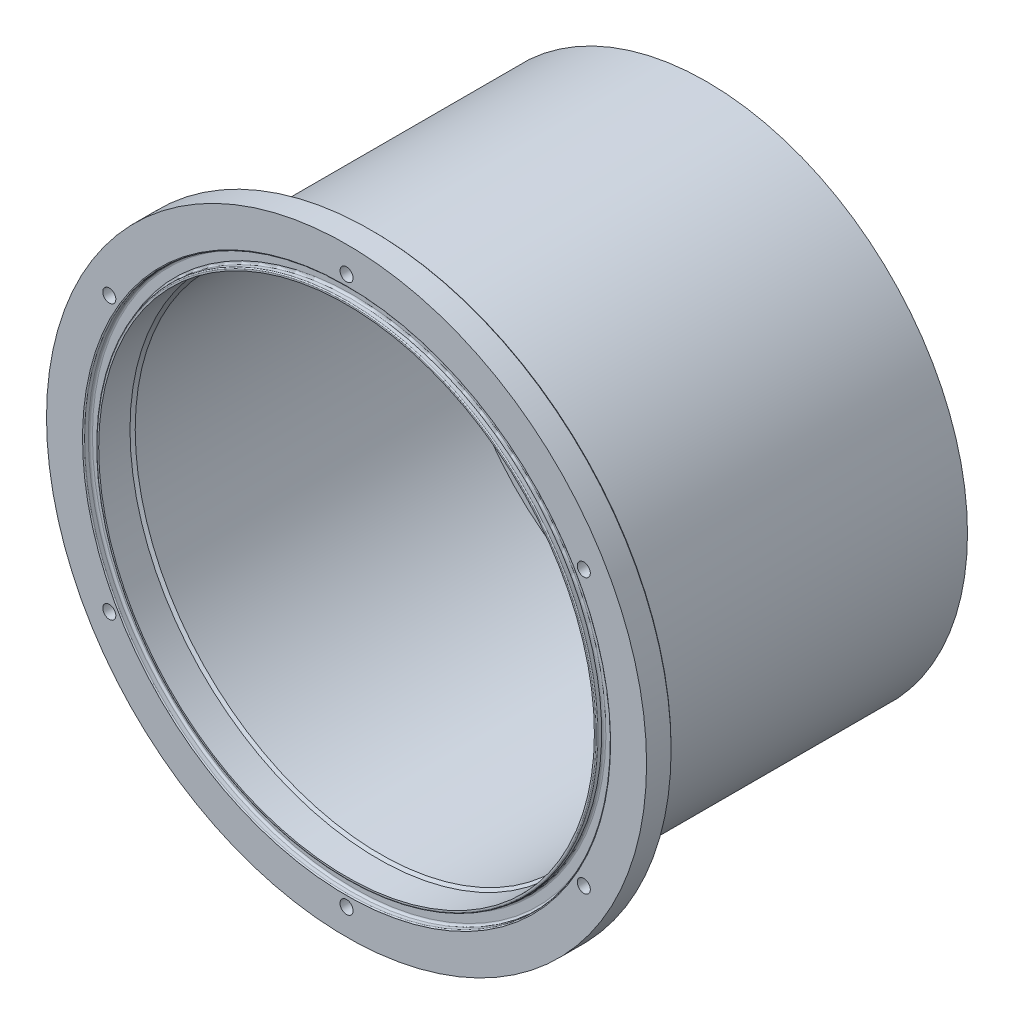
ISO-10303-21;
HEADER;
FILE_DESCRIPTION(('STEP AP214'),'2;1');
FILE_NAME('part.step','',(''),(''),'','','');
FILE_SCHEMA(('AUTOMOTIVE_DESIGN { 1 0 10303 214 1 1 1 1 }'));
ENDSEC;
DATA;
#1=APPLICATION_CONTEXT('core data for automotive mechanical design processes');
#2=APPLICATION_PROTOCOL_DEFINITION('international standard','automotive_design',2000,#1);
#3=PRODUCT_CONTEXT('',#1,'mechanical');
#4=PRODUCT('Part','Part','',(#3));
#5=PRODUCT_RELATED_PRODUCT_CATEGORY('part','',(#4));
#6=PRODUCT_DEFINITION_FORMATION('','',#4);
#7=PRODUCT_DEFINITION_CONTEXT('part definition',#1,'design');
#8=PRODUCT_DEFINITION('design','',#6,#7);
#9=PRODUCT_DEFINITION_SHAPE('','',#8);
#10=(LENGTH_UNIT() NAMED_UNIT(*) SI_UNIT(.MILLI.,.METRE.));
#11=(NAMED_UNIT(*) PLANE_ANGLE_UNIT() SI_UNIT($,.RADIAN.));
#12=(NAMED_UNIT(*) SI_UNIT($,.STERADIAN.) SOLID_ANGLE_UNIT());
#13=UNCERTAINTY_MEASURE_WITH_UNIT(LENGTH_MEASURE(1.E-05),#10,'distance_accuracy_value','');
#14=(GEOMETRIC_REPRESENTATION_CONTEXT(3) GLOBAL_UNCERTAINTY_ASSIGNED_CONTEXT((#13)) GLOBAL_UNIT_ASSIGNED_CONTEXT((#10,
#11,#12)) REPRESENTATION_CONTEXT('',''));
#15=CARTESIAN_POINT('',(0.,0.,0.));
#16=DIRECTION('',(0.,0.,1.));
#17=DIRECTION('',(1.,0.,0.));
#18=AXIS2_PLACEMENT_3D('',#15,#16,#17);
#19=CARTESIAN_POINT('',(0.,0.00386803779899025,14.0038680378037));
#20=DIRECTION('',(0.,0.,-1.));
#21=DIRECTION('',(1.,0.,0.));
#22=AXIS2_PLACEMENT_3D('',#19,#20,#21);
#23=CYLINDRICAL_SURFACE('',#22,47.);
#24=CARTESIAN_POINT('',(0.,0.00386803779899025,-6.4961319621963));
#25=DIRECTION('',(0.,0.,1.));
#26=DIRECTION('',(-1.,0.,0.));
#27=AXIS2_PLACEMENT_3D('',#24,#25,#26);
#28=CIRCLE('',#27,47.);
#29=CARTESIAN_POINT('',(-47.,0.00386803779899025,-6.4961319621963));
#30=VERTEX_POINT('',#29);
#31=EDGE_CURVE('E136',#30,#30,#28,.F.);
#32=ORIENTED_EDGE('',*,*,#31,.F.);
#33=EDGE_LOOP('',(#32));
#34=FACE_BOUND('',#33,.T.);
#35=CARTESIAN_POINT('',(0.,0.00386803779901598,-65.9961319621962));
#36=DIRECTION('',(0.,0.,-1.));
#37=DIRECTION('',(-1.,0.,0.));
#38=AXIS2_PLACEMENT_3D('',#35,#36,#37);
#39=CIRCLE('',#38,47.);
#40=CARTESIAN_POINT('',(-47.,0.00386803779901598,-65.9961319621962));
#41=VERTEX_POINT('',#40);
#42=EDGE_CURVE('E142',#41,#41,#39,.T.);
#43=ORIENTED_EDGE('',*,*,#42,.T.);
#44=EDGE_LOOP('',(#43));
#45=FACE_BOUND('',#44,.T.);
#46=ADVANCED_FACE('F50',(#34,#45),#23,.F.);
#47=CARTESIAN_POINT('',(-48.4000000002915,0.00386803779948985,-1.29613196219625));
#48=DIRECTION('',(0.,0.,1.));
#49=DIRECTION('',(0.,1.,0.));
#50=AXIS2_PLACEMENT_3D('',#47,#48,#49);
#51=PLANE('',#50);
#52=CARTESIAN_POINT('',(0.,0.00386803779948985,-1.29613196219615));
#53=DIRECTION('',(0.,0.,-1.));
#54=DIRECTION('',(0.,1.,0.));
#55=AXIS2_PLACEMENT_3D('',#52,#53,#54);
#56=CIRCLE('',#55,50.0000000000247);
#57=CARTESIAN_POINT('',(0.,50.0038680378242,-1.29613196219613));
#58=VERTEX_POINT('',#57);
#59=EDGE_CURVE('E121',#58,#58,#56,.T.);
#60=ORIENTED_EDGE('',*,*,#59,.F.);
#61=EDGE_LOOP('',(#60));
#62=FACE_BOUND('',#61,.T.);
#63=CARTESIAN_POINT('',(0.,0.00386803779948985,-1.2961319621964));
#64=DIRECTION('',(0.,0.,-1.));
#65=DIRECTION('',(0.,1.,0.));
#66=AXIS2_PLACEMENT_3D('',#63,#64,#65);
#67=CIRCLE('',#66,48.4000000002921);
#68=CARTESIAN_POINT('',(0.,48.4038680380916,-1.29613196219638));
#69=VERTEX_POINT('',#68);
#70=EDGE_CURVE('E118',#69,#69,#67,.T.);
#71=ORIENTED_EDGE('',*,*,#70,.T.);
#72=EDGE_LOOP('',(#71));
#73=FACE_BOUND('',#72,.T.);
#74=ADVANCED_FACE('F157',(#62,#73),#51,.T.);
#75=CARTESIAN_POINT('',(0.,0.00386803779948985,-0.896131962333339));
#76=DIRECTION('',(0.,0.,1.));
#77=DIRECTION('',(0.,1.,0.));
#78=AXIS2_PLACEMENT_3D('',#75,#76,#77);
#79=TOROIDAL_SURFACE('',#78,48.3999999998605,0.399999999863066);
#80=ORIENTED_EDGE('',*,*,#70,.F.);
#81=EDGE_LOOP('',(#80));
#82=FACE_BOUND('',#81,.T.);
#83=CARTESIAN_POINT('',(0.,0.00386803779948985,-0.896131962333548));
#84=DIRECTION('',(0.,0.,-1.));
#85=DIRECTION('',(0.,1.,0.));
#86=AXIS2_PLACEMENT_3D('',#83,#84,#85);
#87=CIRCLE('',#86,47.9999999999974);
#88=CARTESIAN_POINT('',(0.,48.0038680377969,-0.896131962333529));
#89=VERTEX_POINT('',#88);
#90=EDGE_CURVE('E115',#89,#89,#87,.T.);
#91=ORIENTED_EDGE('',*,*,#90,.T.);
#92=EDGE_LOOP('',(#91));
#93=FACE_BOUND('',#92,.T.);
#94=ADVANCED_FACE('F166',(#82,#93),#79,.F.);
#95=CARTESIAN_POINT('',(0.,0.00386803779948985,0.00386803780375033));
#96=DIRECTION('',(0.,0.,1.));
#97=DIRECTION('',(0.,1.,0.));
#98=AXIS2_PLACEMENT_3D('',#95,#96,#97);
#99=CYLINDRICAL_SURFACE('',#98,47.9999999999987);
#100=ORIENTED_EDGE('',*,*,#90,.F.);
#101=EDGE_LOOP('',(#100));
#102=FACE_BOUND('',#101,.T.);
#103=CARTESIAN_POINT('',(0.,0.00386803779948985,-0.196131962257096));
#104=DIRECTION('',(0.,0.,-1.));
#105=DIRECTION('',(0.,1.,0.));
#106=AXIS2_PLACEMENT_3D('',#103,#104,#105);
#107=CIRCLE('',#106,48.);
#108=CARTESIAN_POINT('',(0.,48.0038680377995,-0.196131962257077));
#109=VERTEX_POINT('',#108);
#110=EDGE_CURVE('E109',#109,#109,#107,.T.);
#111=ORIENTED_EDGE('',*,*,#110,.T.);
#112=EDGE_LOOP('',(#111));
#113=FACE_BOUND('',#112,.T.);
#114=ADVANCED_FACE('F204',(#102,#113),#99,.T.);
#115=CARTESIAN_POINT('',(0.,0.00386803779948985,-0.196131962292546));
#116=DIRECTION('',(0.,0.,1.));
#117=DIRECTION('',(0.,1.,0.));
#118=AXIS2_PLACEMENT_3D('',#115,#116,#117);
#119=TOROIDAL_SURFACE('',#118,47.7999999999039,0.200000000096218);
#120=ORIENTED_EDGE('',*,*,#110,.F.);
#121=EDGE_LOOP('',(#120));
#122=FACE_BOUND('',#121,.T.);
#123=CARTESIAN_POINT('',(0.,0.00386803779948985,0.00386803780365319));
#124=DIRECTION('',(0.,0.,-1.));
#125=DIRECTION('',(0.,1.,0.));
#126=AXIS2_PLACEMENT_3D('',#123,#124,#125);
#127=CIRCLE('',#126,47.7999999998966);
#128=CARTESIAN_POINT('',(0.,47.8038680376961,0.00386803780367149));
#129=VERTEX_POINT('',#128);
#130=EDGE_CURVE('E112',#129,#129,#127,.T.);
#131=ORIENTED_EDGE('',*,*,#130,.T.);
#132=EDGE_LOOP('',(#131));
#133=FACE_BOUND('',#132,.T.);
#134=ADVANCED_FACE('F208',(#122,#133),#119,.T.);
#135=CARTESIAN_POINT('',(0.,0.00386803779924005,0.00386803780395156));
#136=DIRECTION('',(0.,0.,-1.));
#137=DIRECTION('',(-1.,0.,0.));
#138=AXIS2_PLACEMENT_3D('',#135,#136,#137);
#139=PLANE('',#138);
#140=CARTESIAN_POINT('',(0.,0.00386803779924005,0.00386803780370176));
#141=DIRECTION('',(0.,0.,-1.));
#142=DIRECTION('',(-1.,0.,0.));
#143=AXIS2_PLACEMENT_3D('',#140,#141,#142);
#144=CIRCLE('',#143,47.5);
#145=CARTESIAN_POINT('',(-47.5,0.00386803779924005,0.00386803780370176));
#146=VERTEX_POINT('',#145);
#147=EDGE_CURVE('E130',#146,#146,#144,.T.);
#148=ORIENTED_EDGE('',*,*,#147,.T.);
#149=EDGE_LOOP('',(#148));
#150=FACE_BOUND('',#149,.T.);
#151=ORIENTED_EDGE('',*,*,#130,.F.);
#152=EDGE_LOOP('',(#151));
#153=FACE_BOUND('',#152,.T.);
#154=ADVANCED_FACE('F212',(#150,#153),#139,.F.);
#155=CARTESIAN_POINT('',(0.,0.00386803779924005,-5.9961319621963));
#156=DIRECTION('',(0.,0.,1.));
#157=DIRECTION('',(1.,0.,0.));
#158=AXIS2_PLACEMENT_3D('',#155,#156,#157);
#159=CYLINDRICAL_SURFACE('',#158,47.5);
#160=CARTESIAN_POINT('',(0.,0.00386803779924005,-5.9961319621963));
#161=DIRECTION('',(0.,0.,-1.));
#162=DIRECTION('',(-1.,0.,0.));
#163=AXIS2_PLACEMENT_3D('',#160,#161,#162);
#164=CIRCLE('',#163,47.5);
#165=CARTESIAN_POINT('',(-47.5,0.00386803779924005,-5.9961319621963));
#166=VERTEX_POINT('',#165);
#167=EDGE_CURVE('E133',#166,#166,#164,.T.);
#168=ORIENTED_EDGE('',*,*,#167,.T.);
#169=EDGE_LOOP('',(#168));
#170=FACE_BOUND('',#169,.T.);
#171=ORIENTED_EDGE('',*,*,#147,.F.);
#172=EDGE_LOOP('',(#171));
#173=FACE_BOUND('',#172,.T.);
#174=ADVANCED_FACE('F182',(#170,#173),#159,.F.);
#175=CARTESIAN_POINT('',(0.,0.00386803779899025,-6.4961319621963));
#176=DIRECTION('',(0.,0.,1.));
#177=DIRECTION('',(1.,0.,0.));
#178=AXIS2_PLACEMENT_3D('',#175,#176,#177);
#179=CONICAL_SURFACE('',#178,47.,0.785398163397448);
#180=ORIENTED_EDGE('',*,*,#167,.F.);
#181=EDGE_LOOP('',(#180));
#182=FACE_BOUND('',#181,.T.);
#183=ORIENTED_EDGE('',*,*,#31,.T.);
#184=EDGE_LOOP('',(#183));
#185=FACE_BOUND('',#184,.T.);
#186=ADVANCED_FACE('F199',(#182,#185),#179,.F.);
#187=CARTESIAN_POINT('',(0.,0.00386803779948985,-0.896131962347099));
#188=DIRECTION('',(0.,0.,1.));
#189=DIRECTION('',(0.,1.,0.));
#190=AXIS2_PLACEMENT_3D('',#187,#188,#189);
#191=TOROIDAL_SURFACE('',#190,50.0000000001507,0.399999999849023);
#192=CARTESIAN_POINT('',(0.,0.00386803779948985,-0.8961319622642));
#193=DIRECTION('',(0.,0.,-1.));
#194=DIRECTION('',(0.,1.,0.));
#195=AXIS2_PLACEMENT_3D('',#192,#193,#194);
#196=CIRCLE('',#195,50.4);
#197=CARTESIAN_POINT('',(0.,50.4038680377995,-0.896131962264181));
#198=VERTEX_POINT('',#197);
#199=EDGE_CURVE('E124',#198,#198,#196,.T.);
#200=ORIENTED_EDGE('',*,*,#199,.F.);
#201=EDGE_LOOP('',(#200));
#202=FACE_BOUND('',#201,.T.);
#203=ORIENTED_EDGE('',*,*,#59,.T.);
#204=EDGE_LOOP('',(#203));
#205=FACE_BOUND('',#204,.T.);
#206=ADVANCED_FACE('F196',(#202,#205),#191,.F.);
#207=CARTESIAN_POINT('',(0.,0.00386803779948985,0.00386803780375033));
#208=DIRECTION('',(0.,0.,1.));
#209=DIRECTION('',(0.,1.,0.));
#210=AXIS2_PLACEMENT_3D('',#207,#208,#209);
#211=CYLINDRICAL_SURFACE('',#210,50.4);
#212=CARTESIAN_POINT('',(0.,0.00386803779948985,-0.196131961980345));
#213=DIRECTION('',(0.,0.,-1.));
#214=DIRECTION('',(0.,1.,0.));
#215=AXIS2_PLACEMENT_3D('',#212,#213,#214);
#216=CIRCLE('',#215,50.4);
#217=CARTESIAN_POINT('',(0.,50.4038680377995,-0.196131961980325));
#218=VERTEX_POINT('',#217);
#219=EDGE_CURVE('E127',#218,#218,#216,.T.);
#220=ORIENTED_EDGE('',*,*,#219,.F.);
#221=EDGE_LOOP('',(#220));
#222=FACE_BOUND('',#221,.T.);
#223=ORIENTED_EDGE('',*,*,#199,.T.);
#224=EDGE_LOOP('',(#223));
#225=FACE_BOUND('',#224,.T.);
#226=ADVANCED_FACE('F192',(#222,#225),#211,.F.);
#227=CARTESIAN_POINT('',(0.,0.00386803779948985,-0.196131962528351));
#228=DIRECTION('',(0.,0.,1.));
#229=DIRECTION('',(0.,1.,0.));
#230=AXIS2_PLACEMENT_3D('',#227,#228,#229);
#231=TOROIDAL_SURFACE('',#230,50.6000000002745,0.200000000274529);
#232=CARTESIAN_POINT('',(0.,0.00386803779948985,0.00386803774619915));
#233=DIRECTION('',(0.,0.,-1.));
#234=DIRECTION('',(0.,1.,0.));
#235=AXIS2_PLACEMENT_3D('',#232,#233,#234);
#236=CIRCLE('',#235,50.6000000002734);
#237=CARTESIAN_POINT('',(0.,50.6038680380729,0.00386803774621852));
#238=VERTEX_POINT('',#237);
#239=EDGE_CURVE('E106',#238,#238,#236,.T.);
#240=ORIENTED_EDGE('',*,*,#239,.F.);
#241=EDGE_LOOP('',(#240));
#242=FACE_BOUND('',#241,.T.);
#243=ORIENTED_EDGE('',*,*,#219,.T.);
#244=EDGE_LOOP('',(#243));
#245=FACE_BOUND('',#244,.T.);
#246=ADVANCED_FACE('F189',(#242,#245),#231,.T.);
#247=CARTESIAN_POINT('',(0.,0.00386803779924005,-4.99613196219605));
#248=DIRECTION('',(0.,0.,1.));
#249=DIRECTION('',(1.,0.,0.));
#250=AXIS2_PLACEMENT_3D('',#247,#248,#249);
#251=CYLINDRICAL_SURFACE('',#250,57.5);
#252=CARTESIAN_POINT('',(0.,0.00386803779924005,-4.69613196219604));
#253=DIRECTION('',(0.,0.,1.));
#254=DIRECTION('',(-1.,0.,0.));
#255=AXIS2_PLACEMENT_3D('',#252,#253,#254);
#256=CIRCLE('',#255,57.5);
#257=CARTESIAN_POINT('',(-57.5,0.00386803779924005,-4.69613196219604));
#258=VERTEX_POINT('',#257);
#259=EDGE_CURVE('E11',#258,#258,#256,.F.);
#260=ORIENTED_EDGE('',*,*,#259,.F.);
#261=EDGE_LOOP('',(#260));
#262=FACE_BOUND('',#261,.T.);
#263=CARTESIAN_POINT('',(0.,0.00386803779924005,0.00386803780395156));
#264=DIRECTION('',(0.,0.,1.));
#265=DIRECTION('',(-1.,0.,0.));
#266=AXIS2_PLACEMENT_3D('',#263,#264,#265);
#267=CIRCLE('',#266,57.5);
#268=CARTESIAN_POINT('',(-57.5,0.00386803779924005,0.00386803780395156));
#269=VERTEX_POINT('',#268);
#270=EDGE_CURVE('E57',#269,#269,#267,.T.);
#271=ORIENTED_EDGE('',*,*,#270,.F.);
#272=EDGE_LOOP('',(#271));
#273=FACE_BOUND('',#272,.T.);
#274=ADVANCED_FACE('F52',(#262,#273),#251,.T.);
#275=CARTESIAN_POINT('',(45.4663336986835,-26.2461319622007,0.00386803780400707));
#276=DIRECTION('',(0.,0.,1.));
#277=DIRECTION('',(0.866025403784439,-0.5,0.));
#278=AXIS2_PLACEMENT_3D('',#275,#276,#277);
#279=CIRCLE('',#278,1.25);
#280=CARTESIAN_POINT('',(46.548865453414,-26.8711319622007,0.00386803780400695));
#281=VERTEX_POINT('',#280);
#282=EDGE_CURVE('E88',#281,#281,#279,.T.);
#283=ORIENTED_EDGE('',*,*,#282,.F.);
#284=EDGE_LOOP('',(#283));
#285=FACE_BOUND('',#284,.T.);
#286=CARTESIAN_POINT('',(45.4663336986835,26.2538680377992,0.00386803780400707));
#287=DIRECTION('',(0.,0.,1.));
#288=DIRECTION('',(0.866025403784438,0.5,0.));
#289=AXIS2_PLACEMENT_3D('',#286,#287,#288);
#290=CIRCLE('',#289,1.25);
#291=CARTESIAN_POINT('',(46.548865453414,26.8788680377992,0.00386803780400735));
#292=VERTEX_POINT('',#291);
#293=EDGE_CURVE('E91',#292,#292,#290,.T.);
#294=ORIENTED_EDGE('',*,*,#293,.F.);
#295=EDGE_LOOP('',(#294));
#296=FACE_BOUND('',#295,.T.);
#297=CARTESIAN_POINT('',(0.,52.5038680377992,0.00386803780405565));
#298=DIRECTION('',(0.,0.,1.));
#299=DIRECTION('',(0.,1.,0.));
#300=AXIS2_PLACEMENT_3D('',#297,#298,#299);
#301=CIRCLE('',#300,1.25);
#302=CARTESIAN_POINT('',(0.,53.7538680377992,0.00386803780405613));
#303=VERTEX_POINT('',#302);
#304=EDGE_CURVE('E94',#303,#303,#301,.T.);
#305=ORIENTED_EDGE('',*,*,#304,.F.);
#306=EDGE_LOOP('',(#305));
#307=FACE_BOUND('',#306,.T.);
#308=CARTESIAN_POINT('',(-45.4663336986825,26.2538680377993,0.00386803780400707));
#309=DIRECTION('',(0.,0.,1.));
#310=DIRECTION('',(-0.866025403784439,0.5,0.));
#311=AXIS2_PLACEMENT_3D('',#308,#309,#310);
#312=CIRCLE('',#311,1.25);
#313=CARTESIAN_POINT('',(-46.5488654534131,26.8788680377993,0.00386803780400735));
#314=VERTEX_POINT('',#313);
#315=EDGE_CURVE('E97',#314,#314,#312,.T.);
#316=ORIENTED_EDGE('',*,*,#315,.F.);
#317=EDGE_LOOP('',(#316));
#318=FACE_BOUND('',#317,.T.);
#319=CARTESIAN_POINT('',(-45.4663336986825,-26.2461319622007,0.00386803780400707));
#320=DIRECTION('',(0.,0.,1.));
#321=DIRECTION('',(-0.866025403784439,-0.5,0.));
#322=AXIS2_PLACEMENT_3D('',#319,#320,#321);
#323=CIRCLE('',#322,1.25);
#324=CARTESIAN_POINT('',(-46.5488654534131,-26.8711319622007,0.00386803780400695));
#325=VERTEX_POINT('',#324);
#326=EDGE_CURVE('E100',#325,#325,#323,.T.);
#327=ORIENTED_EDGE('',*,*,#326,.F.);
#328=EDGE_LOOP('',(#327));
#329=FACE_BOUND('',#328,.T.);
#330=CARTESIAN_POINT('',(0.,-52.4961319622007,0.00386803780400707));
#331=DIRECTION('',(0.,0.,1.));
#332=DIRECTION('',(0.,-1.,0.));
#333=AXIS2_PLACEMENT_3D('',#330,#331,#332);
#334=CIRCLE('',#333,1.25);
#335=CARTESIAN_POINT('',(0.,-53.7461319622007,0.00386803780400675));
#336=VERTEX_POINT('',#335);
#337=EDGE_CURVE('E103',#336,#336,#334,.T.);
#338=ORIENTED_EDGE('',*,*,#337,.F.);
#339=EDGE_LOOP('',(#338));
#340=FACE_BOUND('',#339,.T.);
#341=ORIENTED_EDGE('',*,*,#239,.T.);
#342=EDGE_LOOP('',(#341));
#343=FACE_BOUND('',#342,.T.);
#344=ORIENTED_EDGE('',*,*,#270,.T.);
#345=EDGE_LOOP('',(#344));
#346=FACE_BOUND('',#345,.T.);
#347=ADVANCED_FACE('F216',(#285,#296,#307,#318,#329,#340,#343,#346),#139,.F.);
#348=CARTESIAN_POINT('',(0.,0.00386803779924005,-4.99613196219605));
#349=DIRECTION('',(0.,0.,1.));
#350=DIRECTION('',(1.,0.,0.));
#351=AXIS2_PLACEMENT_3D('',#348,#349,#350);
#352=CONICAL_SURFACE('',#351,57.2,0.785398163397451);
#353=ORIENTED_EDGE('',*,*,#259,.T.);
#354=EDGE_LOOP('',(#353));
#355=FACE_BOUND('',#354,.T.);
#356=CARTESIAN_POINT('',(0.,0.00386803779924005,-4.99613196219605));
#357=DIRECTION('',(0.,0.,1.));
#358=DIRECTION('',(-1.,0.,0.));
#359=AXIS2_PLACEMENT_3D('',#356,#357,#358);
#360=CIRCLE('',#359,57.2);
#361=CARTESIAN_POINT('',(-57.2,0.00386803779924005,-4.99613196219605));
#362=VERTEX_POINT('',#361);
#363=EDGE_CURVE('E85',#362,#362,#360,.T.);
#364=ORIENTED_EDGE('',*,*,#363,.T.);
#365=EDGE_LOOP('',(#364));
#366=FACE_BOUND('',#365,.T.);
#367=ADVANCED_FACE('F187',(#355,#366),#352,.T.);
#368=CARTESIAN_POINT('',(0.,-52.4961319622007,0.00386803780400707));
#369=DIRECTION('',(0.,0.,1.));
#370=DIRECTION('',(0.,-1.,0.));
#371=AXIS2_PLACEMENT_3D('',#368,#369,#370);
#372=CYLINDRICAL_SURFACE('',#371,1.25);
#373=CARTESIAN_POINT('',(0.,-52.4961319622007,-4.99613196219609));
#374=DIRECTION('',(0.,0.,1.));
#375=DIRECTION('',(-1.,0.,0.));
#376=AXIS2_PLACEMENT_3D('',#373,#374,#375);
#377=CIRCLE('',#376,1.25);
#378=CARTESIAN_POINT('',(-1.25,-52.4961319622007,-4.99613196219609));
#379=VERTEX_POINT('',#378);
#380=EDGE_CURVE('E82',#379,#379,#377,.T.);
#381=ORIENTED_EDGE('',*,*,#380,.F.);
#382=EDGE_LOOP('',(#381));
#383=FACE_BOUND('',#382,.T.);
#384=ORIENTED_EDGE('',*,*,#337,.T.);
#385=EDGE_LOOP('',(#384));
#386=FACE_BOUND('',#385,.T.);
#387=ADVANCED_FACE('F183',(#383,#386),#372,.F.);
#388=CARTESIAN_POINT('',(-45.4663336986825,-26.2461319622007,0.00386803780400707));
#389=DIRECTION('',(0.,0.,1.));
#390=DIRECTION('',(-0.866025403784439,-0.5,0.));
#391=AXIS2_PLACEMENT_3D('',#388,#389,#390);
#392=CYLINDRICAL_SURFACE('',#391,1.25);
#393=CARTESIAN_POINT('',(-45.4663336986825,-26.2461319622007,-4.99613196219609));
#394=DIRECTION('',(0.,0.,1.));
#395=DIRECTION('',(-1.,0.,0.));
#396=AXIS2_PLACEMENT_3D('',#393,#394,#395);
#397=CIRCLE('',#396,1.25);
#398=CARTESIAN_POINT('',(-46.7163336986825,-26.2461319622007,-4.99613196219609));
#399=VERTEX_POINT('',#398);
#400=EDGE_CURVE('E76',#399,#399,#397,.T.);
#401=ORIENTED_EDGE('',*,*,#400,.F.);
#402=EDGE_LOOP('',(#401));
#403=FACE_BOUND('',#402,.T.);
#404=ORIENTED_EDGE('',*,*,#326,.T.);
#405=EDGE_LOOP('',(#404));
#406=FACE_BOUND('',#405,.T.);
#407=ADVANCED_FACE('F186',(#403,#406),#392,.F.);
#408=CARTESIAN_POINT('',(-45.4663336986825,26.2538680377993,0.00386803780400707));
#409=DIRECTION('',(0.,0.,1.));
#410=DIRECTION('',(-0.866025403784439,0.5,0.));
#411=AXIS2_PLACEMENT_3D('',#408,#409,#410);
#412=CYLINDRICAL_SURFACE('',#411,1.25);
#413=CARTESIAN_POINT('',(-45.4663336986825,26.2538680377993,-4.99613196219605));
#414=DIRECTION('',(0.,0.,1.));
#415=DIRECTION('',(-1.,0.,0.));
#416=AXIS2_PLACEMENT_3D('',#413,#414,#415);
#417=CIRCLE('',#416,1.25);
#418=CARTESIAN_POINT('',(-46.7163336986825,26.2538680377993,-4.99613196219605));
#419=VERTEX_POINT('',#418);
#420=EDGE_CURVE('E73',#419,#419,#417,.T.);
#421=ORIENTED_EDGE('',*,*,#420,.F.);
#422=EDGE_LOOP('',(#421));
#423=FACE_BOUND('',#422,.T.);
#424=ORIENTED_EDGE('',*,*,#315,.T.);
#425=EDGE_LOOP('',(#424));
#426=FACE_BOUND('',#425,.T.);
#427=ADVANCED_FACE('F260',(#423,#426),#412,.F.);
#428=CARTESIAN_POINT('',(0.,52.5038680377992,0.00386803780405565));
#429=DIRECTION('',(0.,0.,1.));
#430=DIRECTION('',(0.,1.,0.));
#431=AXIS2_PLACEMENT_3D('',#428,#429,#430);
#432=CYLINDRICAL_SURFACE('',#431,1.25);
#433=CARTESIAN_POINT('',(0.,52.5038680377992,-4.99613196219605));
#434=DIRECTION('',(0.,0.,1.));
#435=DIRECTION('',(-1.,0.,0.));
#436=AXIS2_PLACEMENT_3D('',#433,#434,#435);
#437=CIRCLE('',#436,1.25);
#438=CARTESIAN_POINT('',(-1.25,52.5038680377992,-4.99613196219605));
#439=VERTEX_POINT('',#438);
#440=EDGE_CURVE('E70',#439,#439,#437,.T.);
#441=ORIENTED_EDGE('',*,*,#440,.F.);
#442=EDGE_LOOP('',(#441));
#443=FACE_BOUND('',#442,.T.);
#444=ORIENTED_EDGE('',*,*,#304,.T.);
#445=EDGE_LOOP('',(#444));
#446=FACE_BOUND('',#445,.T.);
#447=ADVANCED_FACE('F265',(#443,#446),#432,.F.);
#448=CARTESIAN_POINT('',(45.4663336986835,26.2538680377992,0.00386803780400707));
#449=DIRECTION('',(0.,0.,1.));
#450=DIRECTION('',(0.866025403784438,0.5,0.));
#451=AXIS2_PLACEMENT_3D('',#448,#449,#450);
#452=CYLINDRICAL_SURFACE('',#451,1.25);
#453=CARTESIAN_POINT('',(45.4663336986835,26.2538680377992,-4.99613196219605));
#454=DIRECTION('',(0.,0.,1.));
#455=DIRECTION('',(-1.,0.,0.));
#456=AXIS2_PLACEMENT_3D('',#453,#454,#455);
#457=CIRCLE('',#456,1.25);
#458=CARTESIAN_POINT('',(44.2163336986835,26.2538680377992,-4.99613196219605));
#459=VERTEX_POINT('',#458);
#460=EDGE_CURVE('E65',#459,#459,#457,.T.);
#461=ORIENTED_EDGE('',*,*,#460,.F.);
#462=EDGE_LOOP('',(#461));
#463=FACE_BOUND('',#462,.T.);
#464=ORIENTED_EDGE('',*,*,#293,.T.);
#465=EDGE_LOOP('',(#464));
#466=FACE_BOUND('',#465,.T.);
#467=ADVANCED_FACE('F272',(#463,#466),#452,.F.);
#468=CARTESIAN_POINT('',(45.4663336986835,-26.2461319622007,0.00386803780400707));
#469=DIRECTION('',(0.,0.,1.));
#470=DIRECTION('',(0.866025403784439,-0.5,0.));
#471=AXIS2_PLACEMENT_3D('',#468,#469,#470);
#472=CYLINDRICAL_SURFACE('',#471,1.25);
#473=CARTESIAN_POINT('',(45.4663336986835,-26.2461319622007,-4.99613196219609));
#474=DIRECTION('',(0.,0.,1.));
#475=DIRECTION('',(-1.,0.,0.));
#476=AXIS2_PLACEMENT_3D('',#473,#474,#475);
#477=CIRCLE('',#476,1.25);
#478=CARTESIAN_POINT('',(44.2163336986835,-26.2461319622007,-4.99613196219609));
#479=VERTEX_POINT('',#478);
#480=EDGE_CURVE('E61',#479,#479,#477,.T.);
#481=ORIENTED_EDGE('',*,*,#480,.F.);
#482=EDGE_LOOP('',(#481));
#483=FACE_BOUND('',#482,.T.);
#484=ORIENTED_EDGE('',*,*,#282,.T.);
#485=EDGE_LOOP('',(#484));
#486=FACE_BOUND('',#485,.T.);
#487=ADVANCED_FACE('F177',(#483,#486),#472,.F.);
#488=CARTESIAN_POINT('',(0.,0.00386803779924005,-4.99613196219605));
#489=DIRECTION('',(0.,0.,-1.));
#490=DIRECTION('',(-1.,0.,0.));
#491=AXIS2_PLACEMENT_3D('',#488,#489,#490);
#492=PLANE('',#491);
#493=ORIENTED_EDGE('',*,*,#480,.T.);
#494=EDGE_LOOP('',(#493));
#495=FACE_BOUND('',#494,.T.);
#496=ORIENTED_EDGE('',*,*,#460,.T.);
#497=EDGE_LOOP('',(#496));
#498=FACE_BOUND('',#497,.T.);
#499=ORIENTED_EDGE('',*,*,#440,.T.);
#500=EDGE_LOOP('',(#499));
#501=FACE_BOUND('',#500,.T.);
#502=ORIENTED_EDGE('',*,*,#420,.T.);
#503=EDGE_LOOP('',(#502));
#504=FACE_BOUND('',#503,.T.);
#505=ORIENTED_EDGE('',*,*,#400,.T.);
#506=EDGE_LOOP('',(#505));
#507=FACE_BOUND('',#506,.T.);
#508=CARTESIAN_POINT('',(0.,0.00386803779924005,-4.99613196219605));
#509=DIRECTION('',(0.,0.,1.));
#510=DIRECTION('',(-1.,0.,0.));
#511=AXIS2_PLACEMENT_3D('',#508,#509,#510);
#512=CIRCLE('',#511,50.);
#513=CARTESIAN_POINT('',(-50.,0.00386803779924005,-4.99613196219605));
#514=VERTEX_POINT('',#513);
#515=EDGE_CURVE('E79',#514,#514,#512,.T.);
#516=ORIENTED_EDGE('',*,*,#515,.T.);
#517=EDGE_LOOP('',(#516));
#518=FACE_BOUND('',#517,.T.);
#519=ORIENTED_EDGE('',*,*,#380,.T.);
#520=EDGE_LOOP('',(#519));
#521=FACE_BOUND('',#520,.T.);
#522=ORIENTED_EDGE('',*,*,#363,.F.);
#523=EDGE_LOOP('',(#522));
#524=FACE_BOUND('',#523,.T.);
#525=ADVANCED_FACE('F172',(#495,#498,#501,#504,#507,#518,#521,#524),#492,.T.);
#526=CARTESIAN_POINT('',(0.,0.00386803779924005,-69.996131962196));
#527=DIRECTION('',(0.,0.,1.));
#528=DIRECTION('',(1.,0.,0.));
#529=AXIS2_PLACEMENT_3D('',#526,#527,#528);
#530=CYLINDRICAL_SURFACE('',#529,50.);
#531=CARTESIAN_POINT('',(0.,0.00386803779901801,-68.9961319621962));
#532=DIRECTION('',(0.,0.,-1.));
#533=DIRECTION('',(-1.,0.,0.));
#534=AXIS2_PLACEMENT_3D('',#531,#532,#533);
#535=CIRCLE('',#534,50.0000000000001);
#536=CARTESIAN_POINT('',(-50.0000000000001,0.00386803779901801,-68.9961319621962));
#537=VERTEX_POINT('',#536);
#538=EDGE_CURVE('E139',#537,#537,#535,.T.);
#539=ORIENTED_EDGE('',*,*,#538,.F.);
#540=EDGE_LOOP('',(#539));
#541=FACE_BOUND('',#540,.T.);
#542=ORIENTED_EDGE('',*,*,#515,.F.);
#543=EDGE_LOOP('',(#542));
#544=FACE_BOUND('',#543,.T.);
#545=ADVANCED_FACE('F154',(#541,#544),#530,.T.);
#546=CARTESIAN_POINT('',(0.,0.00386803779901801,-68.9961319621962));
#547=DIRECTION('',(0.,0.,-1.));
#548=DIRECTION('',(-1.,0.,0.));
#549=AXIS2_PLACEMENT_3D('',#546,#547,#548);
#550=PLANE('',#549);
#551=ORIENTED_EDGE('',*,*,#538,.T.);
#552=EDGE_LOOP('',(#551));
#553=FACE_BOUND('',#552,.T.);
#554=ADVANCED_FACE('F149',(#553),#550,.T.);
#555=CARTESIAN_POINT('',(0.,0.00386803779901801,-65.9961319621962));
#556=DIRECTION('',(0.,0.,-1.));
#557=DIRECTION('',(-1.,0.,0.));
#558=AXIS2_PLACEMENT_3D('',#555,#556,#557);
#559=PLANE('',#558);
#560=ORIENTED_EDGE('',*,*,#42,.F.);
#561=EDGE_LOOP('',(#560));
#562=FACE_BOUND('',#561,.T.);
#563=ADVANCED_FACE('F147',(#562),#559,.F.);
#564=CLOSED_SHELL('',(#46,#74,#94,#114,#134,#154,#174,#186,#206,#226,#246,#274,#347,#367,#387,
#407,#427,#447,#467,#487,#525,#545,#554,#563));
#565=MANIFOLD_SOLID_BREP('B2',#564);
#566=ADVANCED_BREP_SHAPE_REPRESENTATION('',(#18,#565),#14);
#567=SHAPE_DEFINITION_REPRESENTATION(#9,#566);
ENDSEC;
END-ISO-10303-21;
